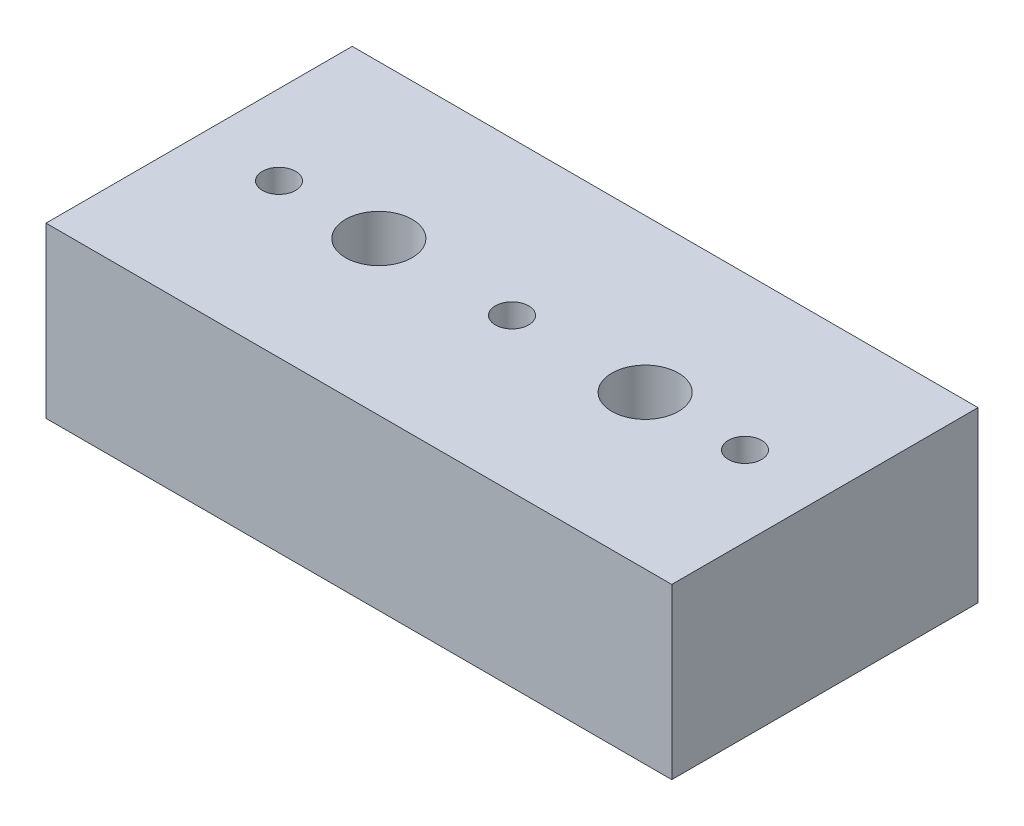
ISO-10303-21;
HEADER;
FILE_DESCRIPTION(('STEP AP214'),'2;1');
FILE_NAME('part.step','',(''),(''),'','','');
FILE_SCHEMA(('AUTOMOTIVE_DESIGN { 1 0 10303 214 1 1 1 1 }'));
ENDSEC;
DATA;
#1=APPLICATION_CONTEXT('core data for automotive mechanical design processes');
#2=APPLICATION_PROTOCOL_DEFINITION('international standard','automotive_design',2000,#1);
#3=PRODUCT_CONTEXT('',#1,'mechanical');
#4=PRODUCT('Part','Part','',(#3));
#5=PRODUCT_RELATED_PRODUCT_CATEGORY('part','',(#4));
#6=PRODUCT_DEFINITION_FORMATION('','',#4);
#7=PRODUCT_DEFINITION_CONTEXT('part definition',#1,'design');
#8=PRODUCT_DEFINITION('design','',#6,#7);
#9=PRODUCT_DEFINITION_SHAPE('','',#8);
#10=(LENGTH_UNIT() NAMED_UNIT(*) SI_UNIT(.MILLI.,.METRE.));
#11=(NAMED_UNIT(*) PLANE_ANGLE_UNIT() SI_UNIT($,.RADIAN.));
#12=(NAMED_UNIT(*) SI_UNIT($,.STERADIAN.) SOLID_ANGLE_UNIT());
#13=UNCERTAINTY_MEASURE_WITH_UNIT(LENGTH_MEASURE(1.E-05),#10,'distance_accuracy_value','');
#14=(GEOMETRIC_REPRESENTATION_CONTEXT(3) GLOBAL_UNCERTAINTY_ASSIGNED_CONTEXT((#13)) GLOBAL_UNIT_ASSIGNED_CONTEXT((#10,
#11,#12)) REPRESENTATION_CONTEXT('',''));
#15=CARTESIAN_POINT('',(0.,0.,0.));
#16=DIRECTION('',(0.,0.,1.));
#17=DIRECTION('',(1.,0.,0.));
#18=AXIS2_PLACEMENT_3D('',#15,#16,#17);
#19=CARTESIAN_POINT('',(0.,6.35,0.));
#20=DIRECTION('',(0.,-1.,0.));
#21=DIRECTION('',(0.,0.,-1.));
#22=AXIS2_PLACEMENT_3D('',#19,#20,#21);
#23=PLANE('',#22);
#24=DIRECTION('',(0.,0.,-1.));
#25=VECTOR('',#24,1.);
#26=CARTESIAN_POINT('',(23.5,6.35,11.5));
#27=LINE('',#26,#25);
#28=CARTESIAN_POINT('',(23.5,6.35,11.5));
#29=VERTEX_POINT('',#28);
#30=CARTESIAN_POINT('',(23.5,6.35,-11.5));
#31=VERTEX_POINT('',#30);
#32=EDGE_CURVE('E85',#29,#31,#27,.T.);
#33=ORIENTED_EDGE('',*,*,#32,.T.);
#34=DIRECTION('',(-1.,0.,0.));
#35=VECTOR('',#34,1.);
#36=CARTESIAN_POINT('',(-23.5,6.35,-11.5));
#37=LINE('',#36,#35);
#38=CARTESIAN_POINT('',(-23.5,6.35,-11.5));
#39=VERTEX_POINT('',#38);
#40=EDGE_CURVE('E80',#31,#39,#37,.T.);
#41=ORIENTED_EDGE('',*,*,#40,.T.);
#42=DIRECTION('',(0.,0.,1.));
#43=VECTOR('',#42,1.);
#44=CARTESIAN_POINT('',(-23.5,6.35,11.5));
#45=LINE('',#44,#43);
#46=CARTESIAN_POINT('',(-23.5,6.35,11.5));
#47=VERTEX_POINT('',#46);
#48=EDGE_CURVE('E83',#39,#47,#45,.T.);
#49=ORIENTED_EDGE('',*,*,#48,.T.);
#50=DIRECTION('',(1.,0.,0.));
#51=VECTOR('',#50,1.);
#52=CARTESIAN_POINT('',(-23.5,6.35,11.5));
#53=LINE('',#52,#51);
#54=EDGE_CURVE('E50',#47,#29,#53,.T.);
#55=ORIENTED_EDGE('',*,*,#54,.T.);
#56=EDGE_LOOP('',(#33,#41,#49,#55));
#57=FACE_BOUND('',#56,.T.);
#58=CARTESIAN_POINT('',(-10.,6.35,0.));
#59=DIRECTION('',(0.,1.,0.));
#60=DIRECTION('',(0.,0.,1.));
#61=AXIS2_PLACEMENT_3D('',#58,#59,#60);
#62=CIRCLE('',#61,2.5);
#63=CARTESIAN_POINT('',(-10.,6.35,2.5));
#64=VERTEX_POINT('',#63);
#65=EDGE_CURVE('E100',#64,#64,#62,.T.);
#66=ORIENTED_EDGE('',*,*,#65,.F.);
#67=EDGE_LOOP('',(#66));
#68=FACE_BOUND('',#67,.T.);
#69=CARTESIAN_POINT('',(10.,6.35,0.));
#70=DIRECTION('',(0.,1.,0.));
#71=DIRECTION('',(0.,0.,1.));
#72=AXIS2_PLACEMENT_3D('',#69,#70,#71);
#73=CIRCLE('',#72,2.5);
#74=CARTESIAN_POINT('',(10.,6.35,2.5));
#75=VERTEX_POINT('',#74);
#76=EDGE_CURVE('E115',#75,#75,#73,.T.);
#77=ORIENTED_EDGE('',*,*,#76,.F.);
#78=EDGE_LOOP('',(#77));
#79=FACE_BOUND('',#78,.T.);
#80=CARTESIAN_POINT('',(17.5,6.35,0.));
#81=DIRECTION('',(0.,1.,0.));
#82=DIRECTION('',(0.,0.,1.));
#83=AXIS2_PLACEMENT_3D('',#80,#81,#82);
#84=CIRCLE('',#83,1.25);
#85=CARTESIAN_POINT('',(17.5,6.35,1.24999999999999));
#86=VERTEX_POINT('',#85);
#87=EDGE_CURVE('E121',#86,#86,#84,.T.);
#88=ORIENTED_EDGE('',*,*,#87,.F.);
#89=EDGE_LOOP('',(#88));
#90=FACE_BOUND('',#89,.T.);
#91=CARTESIAN_POINT('',(0.,6.35,0.));
#92=DIRECTION('',(0.,1.,0.));
#93=DIRECTION('',(0.,0.,1.));
#94=AXIS2_PLACEMENT_3D('',#91,#92,#93);
#95=CIRCLE('',#94,1.25);
#96=CARTESIAN_POINT('',(0.,6.35,1.25));
#97=VERTEX_POINT('',#96);
#98=EDGE_CURVE('E127',#97,#97,#95,.T.);
#99=ORIENTED_EDGE('',*,*,#98,.F.);
#100=EDGE_LOOP('',(#99));
#101=FACE_BOUND('',#100,.T.);
#102=CARTESIAN_POINT('',(-17.5,6.35,0.));
#103=DIRECTION('',(0.,1.,0.));
#104=DIRECTION('',(0.,0.,1.));
#105=AXIS2_PLACEMENT_3D('',#102,#103,#104);
#106=CIRCLE('',#105,1.25);
#107=CARTESIAN_POINT('',(-17.5,6.35,1.25));
#108=VERTEX_POINT('',#107);
#109=EDGE_CURVE('E133',#108,#108,#106,.T.);
#110=ORIENTED_EDGE('',*,*,#109,.F.);
#111=EDGE_LOOP('',(#110));
#112=FACE_BOUND('',#111,.T.);
#113=ADVANCED_FACE('F33',(#57,#68,#79,#90,#101,#112),#23,.F.);
#114=CARTESIAN_POINT('',(0.,-6.35,0.));
#115=DIRECTION('',(0.,-1.,0.));
#116=DIRECTION('',(0.,0.,-1.));
#117=AXIS2_PLACEMENT_3D('',#114,#115,#116);
#118=PLANE('',#117);
#119=CARTESIAN_POINT('',(0.,-6.35,0.));
#120=DIRECTION('',(0.,1.,0.));
#121=DIRECTION('',(0.,0.,1.));
#122=AXIS2_PLACEMENT_3D('',#119,#120,#121);
#123=CIRCLE('',#122,1.25);
#124=CARTESIAN_POINT('',(0.,-6.35,1.25));
#125=VERTEX_POINT('',#124);
#126=EDGE_CURVE('E130',#125,#125,#123,.T.);
#127=ORIENTED_EDGE('',*,*,#126,.T.);
#128=EDGE_LOOP('',(#127));
#129=FACE_BOUND('',#128,.T.);
#130=CARTESIAN_POINT('',(10.,-6.35,0.));
#131=DIRECTION('',(0.,1.,0.));
#132=DIRECTION('',(0.,0.,1.));
#133=AXIS2_PLACEMENT_3D('',#130,#131,#132);
#134=CIRCLE('',#133,2.5);
#135=CARTESIAN_POINT('',(10.,-6.35,2.5));
#136=VERTEX_POINT('',#135);
#137=EDGE_CURVE('E118',#136,#136,#134,.T.);
#138=ORIENTED_EDGE('',*,*,#137,.T.);
#139=EDGE_LOOP('',(#138));
#140=FACE_BOUND('',#139,.T.);
#141=DIRECTION('',(0.,0.,-1.));
#142=VECTOR('',#141,1.);
#143=CARTESIAN_POINT('',(23.5,-6.35,11.5));
#144=LINE('',#143,#142);
#145=CARTESIAN_POINT('',(23.5,-6.35,11.5));
#146=VERTEX_POINT('',#145);
#147=CARTESIAN_POINT('',(23.5,-6.35,-11.5));
#148=VERTEX_POINT('',#147);
#149=EDGE_CURVE('E97',#146,#148,#144,.T.);
#150=ORIENTED_EDGE('',*,*,#149,.F.);
#151=DIRECTION('',(1.,0.,0.));
#152=VECTOR('',#151,1.);
#153=CARTESIAN_POINT('',(-23.5,-6.35,11.5));
#154=LINE('',#153,#152);
#155=CARTESIAN_POINT('',(-23.5,-6.35,11.5));
#156=VERTEX_POINT('',#155);
#157=EDGE_CURVE('E73',#156,#146,#154,.T.);
#158=ORIENTED_EDGE('',*,*,#157,.F.);
#159=DIRECTION('',(0.,0.,1.));
#160=VECTOR('',#159,1.);
#161=CARTESIAN_POINT('',(-23.5,-6.35,11.5));
#162=LINE('',#161,#160);
#163=CARTESIAN_POINT('',(-23.5,-6.35,-11.5));
#164=VERTEX_POINT('',#163);
#165=EDGE_CURVE('E67',#164,#156,#162,.T.);
#166=ORIENTED_EDGE('',*,*,#165,.F.);
#167=DIRECTION('',(-1.,0.,0.));
#168=VECTOR('',#167,1.);
#169=CARTESIAN_POINT('',(-23.5,-6.35,-11.5));
#170=LINE('',#169,#168);
#171=EDGE_CURVE('E89',#148,#164,#170,.T.);
#172=ORIENTED_EDGE('',*,*,#171,.F.);
#173=EDGE_LOOP('',(#150,#158,#166,#172));
#174=FACE_BOUND('',#173,.T.);
#175=CARTESIAN_POINT('',(-10.,-6.35,0.));
#176=DIRECTION('',(0.,1.,0.));
#177=DIRECTION('',(0.,0.,1.));
#178=AXIS2_PLACEMENT_3D('',#175,#176,#177);
#179=CIRCLE('',#178,2.5);
#180=CARTESIAN_POINT('',(-10.,-6.35,2.5));
#181=VERTEX_POINT('',#180);
#182=EDGE_CURVE('E112',#181,#181,#179,.T.);
#183=ORIENTED_EDGE('',*,*,#182,.T.);
#184=EDGE_LOOP('',(#183));
#185=FACE_BOUND('',#184,.T.);
#186=CARTESIAN_POINT('',(17.5,-6.35,0.));
#187=DIRECTION('',(0.,1.,0.));
#188=DIRECTION('',(0.,0.,1.));
#189=AXIS2_PLACEMENT_3D('',#186,#187,#188);
#190=CIRCLE('',#189,1.25);
#191=CARTESIAN_POINT('',(17.5,-6.35,1.24999999999999));
#192=VERTEX_POINT('',#191);
#193=EDGE_CURVE('E124',#192,#192,#190,.T.);
#194=ORIENTED_EDGE('',*,*,#193,.T.);
#195=EDGE_LOOP('',(#194));
#196=FACE_BOUND('',#195,.T.);
#197=CARTESIAN_POINT('',(-17.5,-6.35,0.));
#198=DIRECTION('',(0.,1.,0.));
#199=DIRECTION('',(0.,0.,1.));
#200=AXIS2_PLACEMENT_3D('',#197,#198,#199);
#201=CIRCLE('',#200,1.25);
#202=CARTESIAN_POINT('',(-17.5,-6.35,1.25));
#203=VERTEX_POINT('',#202);
#204=EDGE_CURVE('E136',#203,#203,#201,.T.);
#205=ORIENTED_EDGE('',*,*,#204,.T.);
#206=EDGE_LOOP('',(#205));
#207=FACE_BOUND('',#206,.T.);
#208=ADVANCED_FACE('F108',(#129,#140,#174,#185,#196,#207),#118,.T.);
#209=CARTESIAN_POINT('',(23.5,6.35,11.5));
#210=DIRECTION('',(-1.,0.,0.));
#211=DIRECTION('',(0.,0.,1.));
#212=AXIS2_PLACEMENT_3D('',#209,#210,#211);
#213=PLANE('',#212);
#214=ORIENTED_EDGE('',*,*,#149,.T.);
#215=DIRECTION('',(0.,-1.,0.));
#216=VECTOR('',#215,1.);
#217=CARTESIAN_POINT('',(23.5,6.35,-11.5));
#218=LINE('',#217,#216);
#219=EDGE_CURVE('E11',#31,#148,#218,.T.);
#220=ORIENTED_EDGE('',*,*,#219,.F.);
#221=ORIENTED_EDGE('',*,*,#32,.F.);
#222=DIRECTION('',(0.,-1.,0.));
#223=VECTOR('',#222,1.);
#224=CARTESIAN_POINT('',(23.5,6.35,11.5));
#225=LINE('',#224,#223);
#226=EDGE_CURVE('E93',#29,#146,#225,.T.);
#227=ORIENTED_EDGE('',*,*,#226,.T.);
#228=EDGE_LOOP('',(#214,#220,#221,#227));
#229=FACE_BOUND('',#228,.T.);
#230=ADVANCED_FACE('F35',(#229),#213,.F.);
#231=CARTESIAN_POINT('',(-23.5,6.35,-11.5));
#232=DIRECTION('',(0.,0.,1.));
#233=DIRECTION('',(1.,0.,0.));
#234=AXIS2_PLACEMENT_3D('',#231,#232,#233);
#235=PLANE('',#234);
#236=ORIENTED_EDGE('',*,*,#171,.T.);
#237=DIRECTION('',(0.,-1.,0.));
#238=VECTOR('',#237,1.);
#239=CARTESIAN_POINT('',(-23.5,6.35,-11.5));
#240=LINE('',#239,#238);
#241=EDGE_CURVE('E42',#39,#164,#240,.T.);
#242=ORIENTED_EDGE('',*,*,#241,.F.);
#243=ORIENTED_EDGE('',*,*,#40,.F.);
#244=ORIENTED_EDGE('',*,*,#219,.T.);
#245=EDGE_LOOP('',(#236,#242,#243,#244));
#246=FACE_BOUND('',#245,.T.);
#247=ADVANCED_FACE('F88',(#246),#235,.F.);
#248=CARTESIAN_POINT('',(-23.5,6.35,11.5));
#249=DIRECTION('',(1.,0.,0.));
#250=DIRECTION('',(0.,0.,-1.));
#251=AXIS2_PLACEMENT_3D('',#248,#249,#250);
#252=PLANE('',#251);
#253=ORIENTED_EDGE('',*,*,#165,.T.);
#254=DIRECTION('',(0.,-1.,0.));
#255=VECTOR('',#254,1.);
#256=CARTESIAN_POINT('',(-23.5,6.35,11.5));
#257=LINE('',#256,#255);
#258=EDGE_CURVE('E90',#47,#156,#257,.T.);
#259=ORIENTED_EDGE('',*,*,#258,.F.);
#260=ORIENTED_EDGE('',*,*,#48,.F.);
#261=ORIENTED_EDGE('',*,*,#241,.T.);
#262=EDGE_LOOP('',(#253,#259,#260,#261));
#263=FACE_BOUND('',#262,.T.);
#264=ADVANCED_FACE('F91',(#263),#252,.F.);
#265=CARTESIAN_POINT('',(-23.5,6.35,11.5));
#266=DIRECTION('',(0.,0.,-1.));
#267=DIRECTION('',(-1.,0.,0.));
#268=AXIS2_PLACEMENT_3D('',#265,#266,#267);
#269=PLANE('',#268);
#270=ORIENTED_EDGE('',*,*,#157,.T.);
#271=ORIENTED_EDGE('',*,*,#226,.F.);
#272=ORIENTED_EDGE('',*,*,#54,.F.);
#273=ORIENTED_EDGE('',*,*,#258,.T.);
#274=EDGE_LOOP('',(#270,#271,#272,#273));
#275=FACE_BOUND('',#274,.T.);
#276=ADVANCED_FACE('F105',(#275),#269,.F.);
#277=CARTESIAN_POINT('',(-10.,6.35,0.));
#278=DIRECTION('',(0.,-1.,0.));
#279=DIRECTION('',(0.,0.,-1.));
#280=AXIS2_PLACEMENT_3D('',#277,#278,#279);
#281=CYLINDRICAL_SURFACE('',#280,2.5);
#282=ORIENTED_EDGE('',*,*,#65,.T.);
#283=EDGE_LOOP('',(#282));
#284=FACE_BOUND('',#283,.T.);
#285=ORIENTED_EDGE('',*,*,#182,.F.);
#286=EDGE_LOOP('',(#285));
#287=FACE_BOUND('',#286,.T.);
#288=ADVANCED_FACE('F153',(#284,#287),#281,.F.);
#289=CARTESIAN_POINT('',(10.,6.35,0.));
#290=DIRECTION('',(0.,-1.,0.));
#291=DIRECTION('',(0.,0.,-1.));
#292=AXIS2_PLACEMENT_3D('',#289,#290,#291);
#293=CYLINDRICAL_SURFACE('',#292,2.5);
#294=ORIENTED_EDGE('',*,*,#76,.T.);
#295=EDGE_LOOP('',(#294));
#296=FACE_BOUND('',#295,.T.);
#297=ORIENTED_EDGE('',*,*,#137,.F.);
#298=EDGE_LOOP('',(#297));
#299=FACE_BOUND('',#298,.T.);
#300=ADVANCED_FACE('F199',(#296,#299),#293,.F.);
#301=CARTESIAN_POINT('',(17.5,6.35,0.));
#302=DIRECTION('',(0.,-1.,0.));
#303=DIRECTION('',(0.,0.,-1.));
#304=AXIS2_PLACEMENT_3D('',#301,#302,#303);
#305=CYLINDRICAL_SURFACE('',#304,1.25);
#306=ORIENTED_EDGE('',*,*,#87,.T.);
#307=EDGE_LOOP('',(#306));
#308=FACE_BOUND('',#307,.T.);
#309=ORIENTED_EDGE('',*,*,#193,.F.);
#310=EDGE_LOOP('',(#309));
#311=FACE_BOUND('',#310,.T.);
#312=ADVANCED_FACE('F207',(#308,#311),#305,.F.);
#313=CARTESIAN_POINT('',(0.,6.35,0.));
#314=DIRECTION('',(0.,-1.,0.));
#315=DIRECTION('',(0.,0.,-1.));
#316=AXIS2_PLACEMENT_3D('',#313,#314,#315);
#317=CYLINDRICAL_SURFACE('',#316,1.25);
#318=ORIENTED_EDGE('',*,*,#98,.T.);
#319=EDGE_LOOP('',(#318));
#320=FACE_BOUND('',#319,.T.);
#321=ORIENTED_EDGE('',*,*,#126,.F.);
#322=EDGE_LOOP('',(#321));
#323=FACE_BOUND('',#322,.T.);
#324=ADVANCED_FACE('F215',(#320,#323),#317,.F.);
#325=CARTESIAN_POINT('',(-17.5,6.35,0.));
#326=DIRECTION('',(0.,-1.,0.));
#327=DIRECTION('',(0.,0.,-1.));
#328=AXIS2_PLACEMENT_3D('',#325,#326,#327);
#329=CYLINDRICAL_SURFACE('',#328,1.25);
#330=ORIENTED_EDGE('',*,*,#109,.T.);
#331=EDGE_LOOP('',(#330));
#332=FACE_BOUND('',#331,.T.);
#333=ORIENTED_EDGE('',*,*,#204,.F.);
#334=EDGE_LOOP('',(#333));
#335=FACE_BOUND('',#334,.T.);
#336=ADVANCED_FACE('F142',(#332,#335),#329,.F.);
#337=CLOSED_SHELL('',(#113,#208,#230,#247,#264,#276,#288,#300,#312,#324,#336));
#338=MANIFOLD_SOLID_BREP('B2',#337);
#339=ADVANCED_BREP_SHAPE_REPRESENTATION('',(#18,#338),#14);
#340=SHAPE_DEFINITION_REPRESENTATION(#9,#339);
ENDSEC;
END-ISO-10303-21;
